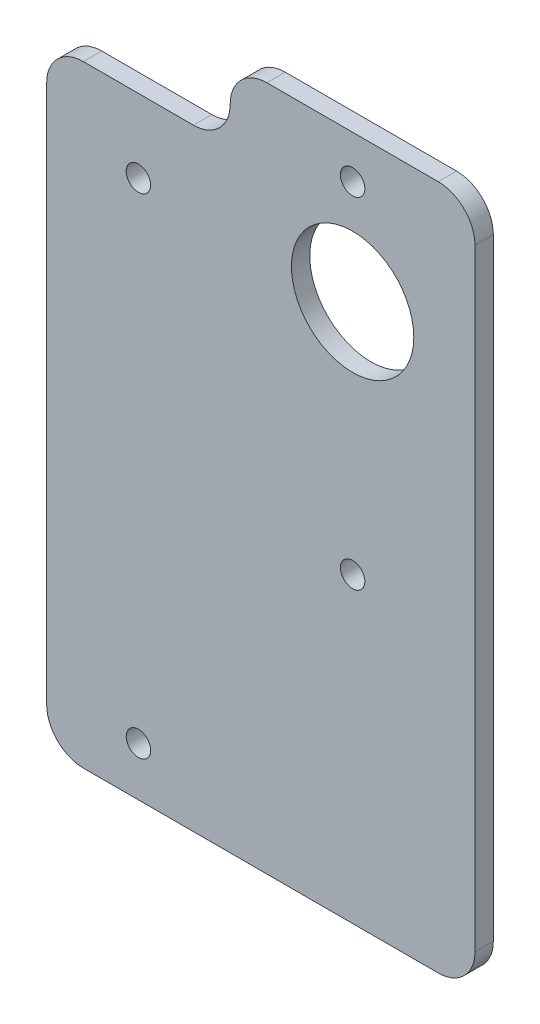
ISO-10303-21;
HEADER;
FILE_DESCRIPTION(('STEP AP214'),'2;1');
FILE_NAME('part.step','',(''),(''),'','','');
FILE_SCHEMA(('AUTOMOTIVE_DESIGN { 1 0 10303 214 1 1 1 1 }'));
ENDSEC;
DATA;
#1=APPLICATION_CONTEXT('core data for automotive mechanical design processes');
#2=APPLICATION_PROTOCOL_DEFINITION('international standard','automotive_design',2000,#1);
#3=PRODUCT_CONTEXT('',#1,'mechanical');
#4=PRODUCT('Part','Part','',(#3));
#5=PRODUCT_RELATED_PRODUCT_CATEGORY('part','',(#4));
#6=PRODUCT_DEFINITION_FORMATION('','',#4);
#7=PRODUCT_DEFINITION_CONTEXT('part definition',#1,'design');
#8=PRODUCT_DEFINITION('design','',#6,#7);
#9=PRODUCT_DEFINITION_SHAPE('','',#8);
#10=(LENGTH_UNIT() NAMED_UNIT(*) SI_UNIT(.MILLI.,.METRE.));
#11=(NAMED_UNIT(*) PLANE_ANGLE_UNIT() SI_UNIT($,.RADIAN.));
#12=(NAMED_UNIT(*) SI_UNIT($,.STERADIAN.) SOLID_ANGLE_UNIT());
#13=UNCERTAINTY_MEASURE_WITH_UNIT(LENGTH_MEASURE(1.E-05),#10,'distance_accuracy_value','');
#14=(GEOMETRIC_REPRESENTATION_CONTEXT(3) GLOBAL_UNCERTAINTY_ASSIGNED_CONTEXT((#13)) GLOBAL_UNIT_ASSIGNED_CONTEXT((#10,
#11,#12)) REPRESENTATION_CONTEXT('',''));
#15=CARTESIAN_POINT('',(0.,0.,0.));
#16=DIRECTION('',(0.,0.,1.));
#17=DIRECTION('',(1.,0.,0.));
#18=AXIS2_PLACEMENT_3D('',#15,#16,#17);
#19=CARTESIAN_POINT('',(0.,0.,1.5));
#20=DIRECTION('',(0.,0.,-1.));
#21=DIRECTION('',(-1.,0.,0.));
#22=AXIS2_PLACEMENT_3D('',#19,#20,#21);
#23=PLANE('',#22);
#24=CARTESIAN_POINT('',(17.4999999997106,-2.80000000006665,1.5));
#25=DIRECTION('',(0.,0.,1.));
#26=DIRECTION('',(1.,0.,0.));
#27=AXIS2_PLACEMENT_3D('',#24,#25,#26);
#28=CIRCLE('',#27,1.00000000018295);
#29=CARTESIAN_POINT('',(18.4999999998935,-2.80000000006665,1.5));
#30=VERTEX_POINT('',#29);
#31=EDGE_CURVE('E158',#30,#30,#28,.T.);
#32=ORIENTED_EDGE('',*,*,#31,.F.);
#33=EDGE_LOOP('',(#32));
#34=FACE_BOUND('',#33,.T.);
#35=CARTESIAN_POINT('',(17.4999999998581,24.9999999999334,1.5));
#36=DIRECTION('',(0.,0.,1.));
#37=DIRECTION('',(1.,0.,0.));
#38=AXIS2_PLACEMENT_3D('',#35,#36,#37);
#39=CIRCLE('',#38,1.00000000018295);
#40=CARTESIAN_POINT('',(18.500000000041,24.9999999999334,1.5));
#41=VERTEX_POINT('',#40);
#42=EDGE_CURVE('E237',#41,#41,#39,.T.);
#43=ORIENTED_EDGE('',*,*,#42,.F.);
#44=EDGE_LOOP('',(#43));
#45=FACE_BOUND('',#44,.T.);
#46=DIRECTION('',(-1.,0.,0.));
#47=VECTOR('',#46,1.);
#48=CARTESIAN_POINT('',(27.5,28.5,1.5));
#49=LINE('',#48,#47);
#50=CARTESIAN_POINT('',(24.5,28.5,1.5));
#51=VERTEX_POINT('',#50);
#52=CARTESIAN_POINT('',(10.5,28.5,1.5));
#53=VERTEX_POINT('',#52);
#54=EDGE_CURVE('E216',#51,#53,#49,.T.);
#55=ORIENTED_EDGE('',*,*,#54,.T.);
#56=CARTESIAN_POINT('',(10.5,25.5,1.5));
#57=DIRECTION('',(0.,0.,-1.));
#58=DIRECTION('',(-1.,0.,0.));
#59=AXIS2_PLACEMENT_3D('',#56,#57,#58);
#60=CIRCLE('',#59,3.);
#61=CARTESIAN_POINT('',(7.5,25.5,1.5));
#62=VERTEX_POINT('',#61);
#63=EDGE_CURVE('E48',#53,#62,#60,.F.);
#64=ORIENTED_EDGE('',*,*,#63,.T.);
#65=CARTESIAN_POINT('',(4.5,25.5,1.5));
#66=DIRECTION('',(0.,0.,-1.));
#67=DIRECTION('',(-1.,0.,0.));
#68=AXIS2_PLACEMENT_3D('',#65,#66,#67);
#69=CIRCLE('',#68,3.);
#70=CARTESIAN_POINT('',(4.5,22.5,1.5));
#71=VERTEX_POINT('',#70);
#72=EDGE_CURVE('E11',#62,#71,#69,.T.);
#73=ORIENTED_EDGE('',*,*,#72,.T.);
#74=DIRECTION('',(-1.,0.,0.));
#75=VECTOR('',#74,1.);
#76=CARTESIAN_POINT('',(7.5,22.5,1.5));
#77=LINE('',#76,#75);
#78=CARTESIAN_POINT('',(-4.5,22.5,1.5));
#79=VERTEX_POINT('',#78);
#80=EDGE_CURVE('E135',#71,#79,#77,.T.);
#81=ORIENTED_EDGE('',*,*,#80,.T.);
#82=CARTESIAN_POINT('',(-4.5,19.5,1.5));
#83=DIRECTION('',(0.,0.,-1.));
#84=DIRECTION('',(-1.,0.,0.));
#85=AXIS2_PLACEMENT_3D('',#82,#83,#84);
#86=CIRCLE('',#85,3.);
#87=CARTESIAN_POINT('',(-7.5,19.5,1.5));
#88=VERTEX_POINT('',#87);
#89=EDGE_CURVE('E182',#79,#88,#86,.F.);
#90=ORIENTED_EDGE('',*,*,#89,.T.);
#91=DIRECTION('',(0.,-1.,0.));
#92=VECTOR('',#91,1.);
#93=CARTESIAN_POINT('',(-7.5,22.5,1.5));
#94=LINE('',#93,#92);
#95=CARTESIAN_POINT('',(-7.49999999999999,-24.5,1.5));
#96=VERTEX_POINT('',#95);
#97=EDGE_CURVE('E143',#88,#96,#94,.T.);
#98=ORIENTED_EDGE('',*,*,#97,.T.);
#99=CARTESIAN_POINT('',(-4.49999999999999,-24.5,1.5));
#100=DIRECTION('',(0.,0.,-1.));
#101=DIRECTION('',(-1.,0.,0.));
#102=AXIS2_PLACEMENT_3D('',#99,#100,#101);
#103=CIRCLE('',#102,3.);
#104=CARTESIAN_POINT('',(-4.49999999999999,-27.5,1.5));
#105=VERTEX_POINT('',#104);
#106=EDGE_CURVE('E178',#96,#105,#103,.F.);
#107=ORIENTED_EDGE('',*,*,#106,.T.);
#108=DIRECTION('',(1.,0.,0.));
#109=VECTOR('',#108,1.);
#110=CARTESIAN_POINT('',(7.49999999999999,-27.5,1.5));
#111=LINE('',#110,#109);
#112=CARTESIAN_POINT('',(24.5,-27.5,1.5));
#113=VERTEX_POINT('',#112);
#114=EDGE_CURVE('E147',#105,#113,#111,.T.);
#115=ORIENTED_EDGE('',*,*,#114,.T.);
#116=CARTESIAN_POINT('',(24.5,-24.5,1.5));
#117=DIRECTION('',(0.,0.,-1.));
#118=DIRECTION('',(-1.,0.,0.));
#119=AXIS2_PLACEMENT_3D('',#116,#117,#118);
#120=CIRCLE('',#119,3.);
#121=CARTESIAN_POINT('',(27.5,-24.5,1.5));
#122=VERTEX_POINT('',#121);
#123=EDGE_CURVE('E176',#113,#122,#120,.F.);
#124=ORIENTED_EDGE('',*,*,#123,.T.);
#125=DIRECTION('',(0.,1.,0.));
#126=VECTOR('',#125,1.);
#127=CARTESIAN_POINT('',(27.5,-27.5,1.5));
#128=LINE('',#127,#126);
#129=CARTESIAN_POINT('',(27.5,25.5,1.5));
#130=VERTEX_POINT('',#129);
#131=EDGE_CURVE('E218',#122,#130,#128,.T.);
#132=ORIENTED_EDGE('',*,*,#131,.T.);
#133=CARTESIAN_POINT('',(24.5,25.5,1.5));
#134=DIRECTION('',(0.,0.,-1.));
#135=DIRECTION('',(-1.,0.,0.));
#136=AXIS2_PLACEMENT_3D('',#133,#134,#135);
#137=CIRCLE('',#136,3.);
#138=EDGE_CURVE('E180',#130,#51,#137,.F.);
#139=ORIENTED_EDGE('',*,*,#138,.T.);
#140=EDGE_LOOP('',(#55,#64,#73,#81,#90,#98,#107,#115,#124,#132,#139));
#141=FACE_BOUND('',#140,.T.);
#142=CARTESIAN_POINT('',(0.,-23.5,1.5));
#143=DIRECTION('',(0.,0.,1.));
#144=DIRECTION('',(1.,0.,0.));
#145=AXIS2_PLACEMENT_3D('',#142,#143,#144);
#146=CIRCLE('',#145,1.);
#147=CARTESIAN_POINT('',(1.,-23.5,1.5));
#148=VERTEX_POINT('',#147);
#149=EDGE_CURVE('E212',#148,#148,#146,.T.);
#150=ORIENTED_EDGE('',*,*,#149,.F.);
#151=EDGE_LOOP('',(#150));
#152=FACE_BOUND('',#151,.T.);
#153=CARTESIAN_POINT('',(0.,16.5,1.5));
#154=DIRECTION('',(0.,0.,1.));
#155=DIRECTION('',(1.,0.,0.));
#156=AXIS2_PLACEMENT_3D('',#153,#154,#155);
#157=CIRCLE('',#156,1.);
#158=CARTESIAN_POINT('',(1.,16.5,1.5));
#159=VERTEX_POINT('',#158);
#160=EDGE_CURVE('E224',#159,#159,#157,.T.);
#161=ORIENTED_EDGE('',*,*,#160,.F.);
#162=EDGE_LOOP('',(#161));
#163=FACE_BOUND('',#162,.T.);
#164=CARTESIAN_POINT('',(17.5,16.5,1.5));
#165=DIRECTION('',(0.,0.,1.));
#166=DIRECTION('',(1.,0.,0.));
#167=AXIS2_PLACEMENT_3D('',#164,#165,#166);
#168=CIRCLE('',#167,5.);
#169=CARTESIAN_POINT('',(22.5,16.5,1.5));
#170=VERTEX_POINT('',#169);
#171=EDGE_CURVE('E230',#170,#170,#168,.T.);
#172=ORIENTED_EDGE('',*,*,#171,.F.);
#173=EDGE_LOOP('',(#172));
#174=FACE_BOUND('',#173,.T.);
#175=ADVANCED_FACE('F33',(#34,#45,#141,#152,#163,#174),#23,.F.);
#176=CARTESIAN_POINT('',(0.,0.,0.));
#177=DIRECTION('',(0.,0.,-1.));
#178=DIRECTION('',(-1.,0.,0.));
#179=AXIS2_PLACEMENT_3D('',#176,#177,#178);
#180=PLANE('',#179);
#181=CARTESIAN_POINT('',(17.4999999997106,-2.80000000006665,0.));
#182=DIRECTION('',(0.,0.,-1.));
#183=DIRECTION('',(-1.,0.,0.));
#184=AXIS2_PLACEMENT_3D('',#181,#182,#183);
#185=CIRCLE('',#184,1.00000000018295);
#186=CARTESIAN_POINT('',(16.4999999995276,-2.80000000006665,0.));
#187=VERTEX_POINT('',#186);
#188=EDGE_CURVE('E157',#187,#187,#185,.T.);
#189=ORIENTED_EDGE('',*,*,#188,.F.);
#190=EDGE_LOOP('',(#189));
#191=FACE_BOUND('',#190,.T.);
#192=CARTESIAN_POINT('',(17.4999999998581,24.9999999999334,0.));
#193=DIRECTION('',(0.,0.,-1.));
#194=DIRECTION('',(-1.,0.,0.));
#195=AXIS2_PLACEMENT_3D('',#192,#193,#194);
#196=CIRCLE('',#195,1.00000000018295);
#197=CARTESIAN_POINT('',(16.4999999996751,24.9999999999334,0.));
#198=VERTEX_POINT('',#197);
#199=EDGE_CURVE('E154',#198,#198,#196,.T.);
#200=ORIENTED_EDGE('',*,*,#199,.F.);
#201=EDGE_LOOP('',(#200));
#202=FACE_BOUND('',#201,.T.);
#203=CARTESIAN_POINT('',(0.,16.5,0.));
#204=DIRECTION('',(0.,0.,1.));
#205=DIRECTION('',(1.,0.,0.));
#206=AXIS2_PLACEMENT_3D('',#203,#204,#205);
#207=CIRCLE('',#206,1.);
#208=CARTESIAN_POINT('',(1.,16.5,0.));
#209=VERTEX_POINT('',#208);
#210=EDGE_CURVE('E227',#209,#209,#207,.T.);
#211=ORIENTED_EDGE('',*,*,#210,.T.);
#212=EDGE_LOOP('',(#211));
#213=FACE_BOUND('',#212,.T.);
#214=DIRECTION('',(-1.,0.,0.));
#215=VECTOR('',#214,1.);
#216=CARTESIAN_POINT('',(7.5,22.5,0.));
#217=LINE('',#216,#215);
#218=CARTESIAN_POINT('',(4.5,22.5,0.));
#219=VERTEX_POINT('',#218);
#220=CARTESIAN_POINT('',(-4.5,22.5,0.));
#221=VERTEX_POINT('',#220);
#222=EDGE_CURVE('E132',#219,#221,#217,.T.);
#223=ORIENTED_EDGE('',*,*,#222,.F.);
#224=CARTESIAN_POINT('',(4.5,25.5,0.));
#225=DIRECTION('',(0.,0.,-1.));
#226=DIRECTION('',(-1.,0.,0.));
#227=AXIS2_PLACEMENT_3D('',#224,#225,#226);
#228=CIRCLE('',#227,3.);
#229=CARTESIAN_POINT('',(7.5,25.5,0.));
#230=VERTEX_POINT('',#229);
#231=EDGE_CURVE('E42',#219,#230,#228,.F.);
#232=ORIENTED_EDGE('',*,*,#231,.T.);
#233=CARTESIAN_POINT('',(10.5,25.5,0.));
#234=DIRECTION('',(0.,0.,-1.));
#235=DIRECTION('',(-1.,0.,0.));
#236=AXIS2_PLACEMENT_3D('',#233,#234,#235);
#237=CIRCLE('',#236,3.);
#238=CARTESIAN_POINT('',(10.5,28.5,0.));
#239=VERTEX_POINT('',#238);
#240=EDGE_CURVE('E169',#230,#239,#237,.T.);
#241=ORIENTED_EDGE('',*,*,#240,.T.);
#242=DIRECTION('',(-1.,0.,0.));
#243=VECTOR('',#242,1.);
#244=CARTESIAN_POINT('',(27.5,28.5,0.));
#245=LINE('',#244,#243);
#246=CARTESIAN_POINT('',(24.5,28.5,0.));
#247=VERTEX_POINT('',#246);
#248=EDGE_CURVE('E144',#247,#239,#245,.T.);
#249=ORIENTED_EDGE('',*,*,#248,.F.);
#250=CARTESIAN_POINT('',(24.5,25.5,0.));
#251=DIRECTION('',(0.,0.,-1.));
#252=DIRECTION('',(-1.,0.,0.));
#253=AXIS2_PLACEMENT_3D('',#250,#251,#252);
#254=CIRCLE('',#253,3.);
#255=CARTESIAN_POINT('',(27.5,25.5,0.));
#256=VERTEX_POINT('',#255);
#257=EDGE_CURVE('E166',#247,#256,#254,.T.);
#258=ORIENTED_EDGE('',*,*,#257,.T.);
#259=DIRECTION('',(0.,1.,0.));
#260=VECTOR('',#259,1.);
#261=CARTESIAN_POINT('',(27.5,22.5,0.));
#262=LINE('',#261,#260);
#263=CARTESIAN_POINT('',(27.5,-24.5,0.));
#264=VERTEX_POINT('',#263);
#265=EDGE_CURVE('E150',#264,#256,#262,.T.);
#266=ORIENTED_EDGE('',*,*,#265,.F.);
#267=CARTESIAN_POINT('',(24.5,-24.5,0.));
#268=DIRECTION('',(0.,0.,-1.));
#269=DIRECTION('',(-1.,0.,0.));
#270=AXIS2_PLACEMENT_3D('',#267,#268,#269);
#271=CIRCLE('',#270,3.);
#272=CARTESIAN_POINT('',(24.5,-27.5,0.));
#273=VERTEX_POINT('',#272);
#274=EDGE_CURVE('E136',#264,#273,#271,.T.);
#275=ORIENTED_EDGE('',*,*,#274,.T.);
#276=DIRECTION('',(1.,0.,0.));
#277=VECTOR('',#276,1.);
#278=CARTESIAN_POINT('',(7.49999999999999,-27.5,0.));
#279=LINE('',#278,#277);
#280=CARTESIAN_POINT('',(-4.49999999999999,-27.5,0.));
#281=VERTEX_POINT('',#280);
#282=EDGE_CURVE('E203',#281,#273,#279,.T.);
#283=ORIENTED_EDGE('',*,*,#282,.F.);
#284=CARTESIAN_POINT('',(-4.49999999999999,-24.5,0.));
#285=DIRECTION('',(0.,0.,-1.));
#286=DIRECTION('',(-1.,0.,0.));
#287=AXIS2_PLACEMENT_3D('',#284,#285,#286);
#288=CIRCLE('',#287,3.);
#289=CARTESIAN_POINT('',(-7.49999999999999,-24.5,0.));
#290=VERTEX_POINT('',#289);
#291=EDGE_CURVE('E164',#281,#290,#288,.T.);
#292=ORIENTED_EDGE('',*,*,#291,.T.);
#293=DIRECTION('',(0.,-1.,0.));
#294=VECTOR('',#293,1.);
#295=CARTESIAN_POINT('',(-7.5,22.5,0.));
#296=LINE('',#295,#294);
#297=CARTESIAN_POINT('',(-7.5,19.5,0.));
#298=VERTEX_POINT('',#297);
#299=EDGE_CURVE('E210',#298,#290,#296,.T.);
#300=ORIENTED_EDGE('',*,*,#299,.F.);
#301=CARTESIAN_POINT('',(-4.5,19.5,0.));
#302=DIRECTION('',(0.,0.,-1.));
#303=DIRECTION('',(-1.,0.,0.));
#304=AXIS2_PLACEMENT_3D('',#301,#302,#303);
#305=CIRCLE('',#304,3.);
#306=EDGE_CURVE('E142',#298,#221,#305,.T.);
#307=ORIENTED_EDGE('',*,*,#306,.T.);
#308=EDGE_LOOP('',(#223,#232,#241,#249,#258,#266,#275,#283,#292,#300,#307));
#309=FACE_BOUND('',#308,.T.);
#310=CARTESIAN_POINT('',(0.,-23.5,0.));
#311=DIRECTION('',(0.,0.,1.));
#312=DIRECTION('',(1.,0.,0.));
#313=AXIS2_PLACEMENT_3D('',#310,#311,#312);
#314=CIRCLE('',#313,1.);
#315=CARTESIAN_POINT('',(1.,-23.5,0.));
#316=VERTEX_POINT('',#315);
#317=EDGE_CURVE('E221',#316,#316,#314,.T.);
#318=ORIENTED_EDGE('',*,*,#317,.T.);
#319=EDGE_LOOP('',(#318));
#320=FACE_BOUND('',#319,.T.);
#321=CARTESIAN_POINT('',(17.5,16.5,0.));
#322=DIRECTION('',(0.,0.,1.));
#323=DIRECTION('',(1.,0.,0.));
#324=AXIS2_PLACEMENT_3D('',#321,#322,#323);
#325=CIRCLE('',#324,5.);
#326=CARTESIAN_POINT('',(22.5,16.5,0.));
#327=VERTEX_POINT('',#326);
#328=EDGE_CURVE('E161',#327,#327,#325,.T.);
#329=ORIENTED_EDGE('',*,*,#328,.T.);
#330=EDGE_LOOP('',(#329));
#331=FACE_BOUND('',#330,.T.);
#332=ADVANCED_FACE('F139',(#191,#202,#213,#309,#320,#331),#180,.T.);
#333=CARTESIAN_POINT('',(-7.5,22.5,1.5));
#334=DIRECTION('',(1.,0.,0.));
#335=DIRECTION('',(0.,1.,0.));
#336=AXIS2_PLACEMENT_3D('',#333,#334,#335);
#337=PLANE('',#336);
#338=ORIENTED_EDGE('',*,*,#97,.F.);
#339=DIRECTION('',(0.,0.,-1.));
#340=VECTOR('',#339,1.);
#341=CARTESIAN_POINT('',(-7.5,19.5,1.5));
#342=LINE('',#341,#340);
#343=EDGE_CURVE('E187',#88,#298,#342,.T.);
#344=ORIENTED_EDGE('',*,*,#343,.T.);
#345=ORIENTED_EDGE('',*,*,#299,.T.);
#346=DIRECTION('',(0.,0.,-1.));
#347=VECTOR('',#346,1.);
#348=CARTESIAN_POINT('',(-7.49999999999999,-24.5,1.5));
#349=LINE('',#348,#347);
#350=EDGE_CURVE('E185',#290,#96,#349,.F.);
#351=ORIENTED_EDGE('',*,*,#350,.T.);
#352=EDGE_LOOP('',(#338,#344,#345,#351));
#353=FACE_BOUND('',#352,.T.);
#354=ADVANCED_FACE('F266',(#353),#337,.F.);
#355=CARTESIAN_POINT('',(7.49999999999999,-27.5,1.5));
#356=DIRECTION('',(0.,1.,0.));
#357=DIRECTION('',(0.,0.,1.));
#358=AXIS2_PLACEMENT_3D('',#355,#356,#357);
#359=PLANE('',#358);
#360=ORIENTED_EDGE('',*,*,#114,.F.);
#361=DIRECTION('',(0.,0.,-1.));
#362=VECTOR('',#361,1.);
#363=CARTESIAN_POINT('',(-4.49999999999999,-27.5,1.5));
#364=LINE('',#363,#362);
#365=EDGE_CURVE('E126',#105,#281,#364,.T.);
#366=ORIENTED_EDGE('',*,*,#365,.T.);
#367=ORIENTED_EDGE('',*,*,#282,.T.);
#368=DIRECTION('',(0.,0.,-1.));
#369=VECTOR('',#368,1.);
#370=CARTESIAN_POINT('',(24.5,-27.5,1.5));
#371=LINE('',#370,#369);
#372=EDGE_CURVE('E194',#273,#113,#371,.F.);
#373=ORIENTED_EDGE('',*,*,#372,.T.);
#374=EDGE_LOOP('',(#360,#366,#367,#373));
#375=FACE_BOUND('',#374,.T.);
#376=ADVANCED_FACE('F202',(#375),#359,.F.);
#377=CARTESIAN_POINT('',(27.5,22.5,1.5));
#378=DIRECTION('',(-1.,0.,0.));
#379=DIRECTION('',(0.,0.,1.));
#380=AXIS2_PLACEMENT_3D('',#377,#378,#379);
#381=PLANE('',#380);
#382=ORIENTED_EDGE('',*,*,#265,.T.);
#383=DIRECTION('',(0.,0.,-1.));
#384=VECTOR('',#383,1.);
#385=CARTESIAN_POINT('',(27.5,25.5,1.5));
#386=LINE('',#385,#384);
#387=EDGE_CURVE('E56',#256,#130,#386,.F.);
#388=ORIENTED_EDGE('',*,*,#387,.T.);
#389=ORIENTED_EDGE('',*,*,#131,.F.);
#390=DIRECTION('',(0.,0.,-1.));
#391=VECTOR('',#390,1.);
#392=CARTESIAN_POINT('',(27.5,-24.5,1.5));
#393=LINE('',#392,#391);
#394=EDGE_CURVE('E190',#122,#264,#393,.T.);
#395=ORIENTED_EDGE('',*,*,#394,.T.);
#396=EDGE_LOOP('',(#382,#388,#389,#395));
#397=FACE_BOUND('',#396,.T.);
#398=ADVANCED_FACE('F284',(#397),#381,.F.);
#399=CARTESIAN_POINT('',(27.5,28.5,1.5));
#400=DIRECTION('',(0.,-1.,0.));
#401=DIRECTION('',(1.,0.,0.));
#402=AXIS2_PLACEMENT_3D('',#399,#400,#401);
#403=PLANE('',#402);
#404=ORIENTED_EDGE('',*,*,#248,.T.);
#405=DIRECTION('',(0.,0.,-1.));
#406=VECTOR('',#405,1.);
#407=CARTESIAN_POINT('',(10.5,28.5,1.5));
#408=LINE('',#407,#406);
#409=EDGE_CURVE('E174',#239,#53,#408,.F.);
#410=ORIENTED_EDGE('',*,*,#409,.T.);
#411=ORIENTED_EDGE('',*,*,#54,.F.);
#412=DIRECTION('',(0.,0.,-1.));
#413=VECTOR('',#412,1.);
#414=CARTESIAN_POINT('',(24.5,28.5,1.5));
#415=LINE('',#414,#413);
#416=EDGE_CURVE('E171',#51,#247,#415,.T.);
#417=ORIENTED_EDGE('',*,*,#416,.T.);
#418=EDGE_LOOP('',(#404,#410,#411,#417));
#419=FACE_BOUND('',#418,.T.);
#420=ADVANCED_FACE('F281',(#419),#403,.F.);
#421=CARTESIAN_POINT('',(7.5,22.5,1.5));
#422=DIRECTION('',(0.,-1.,0.));
#423=DIRECTION('',(0.,0.,-1.));
#424=AXIS2_PLACEMENT_3D('',#421,#422,#423);
#425=PLANE('',#424);
#426=ORIENTED_EDGE('',*,*,#80,.F.);
#427=DIRECTION('',(0.,0.,-1.));
#428=VECTOR('',#427,1.);
#429=CARTESIAN_POINT('',(4.5,22.5,0.));
#430=LINE('',#429,#428);
#431=EDGE_CURVE('E122',#71,#219,#430,.T.);
#432=ORIENTED_EDGE('',*,*,#431,.T.);
#433=ORIENTED_EDGE('',*,*,#222,.T.);
#434=DIRECTION('',(0.,0.,-1.));
#435=VECTOR('',#434,1.);
#436=CARTESIAN_POINT('',(-4.5,22.5,1.5));
#437=LINE('',#436,#435);
#438=EDGE_CURVE('E137',#221,#79,#437,.F.);
#439=ORIENTED_EDGE('',*,*,#438,.T.);
#440=EDGE_LOOP('',(#426,#432,#433,#439));
#441=FACE_BOUND('',#440,.T.);
#442=ADVANCED_FACE('F131',(#441),#425,.F.);
#443=CARTESIAN_POINT('',(0.,-23.5,1.5));
#444=DIRECTION('',(0.,0.,-1.));
#445=DIRECTION('',(-1.,0.,0.));
#446=AXIS2_PLACEMENT_3D('',#443,#444,#445);
#447=CYLINDRICAL_SURFACE('',#446,1.);
#448=ORIENTED_EDGE('',*,*,#149,.T.);
#449=EDGE_LOOP('',(#448));
#450=FACE_BOUND('',#449,.T.);
#451=ORIENTED_EDGE('',*,*,#317,.F.);
#452=EDGE_LOOP('',(#451));
#453=FACE_BOUND('',#452,.T.);
#454=ADVANCED_FACE('F280',(#450,#453),#447,.F.);
#455=CARTESIAN_POINT('',(0.,16.5,1.5));
#456=DIRECTION('',(0.,0.,-1.));
#457=DIRECTION('',(-1.,0.,0.));
#458=AXIS2_PLACEMENT_3D('',#455,#456,#457);
#459=CYLINDRICAL_SURFACE('',#458,1.);
#460=ORIENTED_EDGE('',*,*,#160,.T.);
#461=EDGE_LOOP('',(#460));
#462=FACE_BOUND('',#461,.T.);
#463=ORIENTED_EDGE('',*,*,#210,.F.);
#464=EDGE_LOOP('',(#463));
#465=FACE_BOUND('',#464,.T.);
#466=ADVANCED_FACE('F261',(#462,#465),#459,.F.);
#467=CARTESIAN_POINT('',(17.5,16.5,1.5));
#468=DIRECTION('',(0.,0.,-1.));
#469=DIRECTION('',(-1.,0.,0.));
#470=AXIS2_PLACEMENT_3D('',#467,#468,#469);
#471=CYLINDRICAL_SURFACE('',#470,5.);
#472=ORIENTED_EDGE('',*,*,#171,.T.);
#473=EDGE_LOOP('',(#472));
#474=FACE_BOUND('',#473,.T.);
#475=ORIENTED_EDGE('',*,*,#328,.F.);
#476=EDGE_LOOP('',(#475));
#477=FACE_BOUND('',#476,.T.);
#478=ADVANCED_FACE('F257',(#474,#477),#471,.F.);
#479=CARTESIAN_POINT('',(17.4999999998581,24.9999999999334,-8.5));
#480=DIRECTION('',(0.,0.,1.));
#481=DIRECTION('',(1.,0.,0.));
#482=AXIS2_PLACEMENT_3D('',#479,#480,#481);
#483=CYLINDRICAL_SURFACE('',#482,1.00000000018295);
#484=ORIENTED_EDGE('',*,*,#199,.T.);
#485=EDGE_LOOP('',(#484));
#486=FACE_BOUND('',#485,.T.);
#487=ORIENTED_EDGE('',*,*,#42,.T.);
#488=EDGE_LOOP('',(#487));
#489=FACE_BOUND('',#488,.T.);
#490=ADVANCED_FACE('F260',(#486,#489),#483,.F.);
#491=CARTESIAN_POINT('',(17.4999999997106,-2.80000000006665,-8.5));
#492=DIRECTION('',(0.,0.,1.));
#493=DIRECTION('',(1.,0.,0.));
#494=AXIS2_PLACEMENT_3D('',#491,#492,#493);
#495=CYLINDRICAL_SURFACE('',#494,1.00000000018295);
#496=ORIENTED_EDGE('',*,*,#188,.T.);
#497=EDGE_LOOP('',(#496));
#498=FACE_BOUND('',#497,.T.);
#499=ORIENTED_EDGE('',*,*,#31,.T.);
#500=EDGE_LOOP('',(#499));
#501=FACE_BOUND('',#500,.T.);
#502=ADVANCED_FACE('F243',(#498,#501),#495,.F.);
#503=CARTESIAN_POINT('',(10.5,25.5,1.5));
#504=DIRECTION('',(0.,0.,-1.));
#505=DIRECTION('',(-1.,0.,0.));
#506=AXIS2_PLACEMENT_3D('',#503,#504,#505);
#507=CYLINDRICAL_SURFACE('',#506,3.);
#508=DIRECTION('',(0.,0.,-1.));
#509=VECTOR('',#508,1.);
#510=CARTESIAN_POINT('',(7.5,25.5,1.5));
#511=LINE('',#510,#509);
#512=EDGE_CURVE('E37',#62,#230,#511,.T.);
#513=ORIENTED_EDGE('',*,*,#512,.F.);
#514=ORIENTED_EDGE('',*,*,#63,.F.);
#515=ORIENTED_EDGE('',*,*,#409,.F.);
#516=ORIENTED_EDGE('',*,*,#240,.F.);
#517=EDGE_LOOP('',(#513,#514,#515,#516));
#518=FACE_BOUND('',#517,.T.);
#519=ADVANCED_FACE('F293',(#518),#507,.T.);
#520=CARTESIAN_POINT('',(4.5,25.5,1.5));
#521=DIRECTION('',(0.,0.,1.));
#522=DIRECTION('',(1.,0.,0.));
#523=AXIS2_PLACEMENT_3D('',#520,#521,#522);
#524=CYLINDRICAL_SURFACE('',#523,3.);
#525=ORIENTED_EDGE('',*,*,#72,.F.);
#526=ORIENTED_EDGE('',*,*,#512,.T.);
#527=ORIENTED_EDGE('',*,*,#231,.F.);
#528=ORIENTED_EDGE('',*,*,#431,.F.);
#529=EDGE_LOOP('',(#525,#526,#527,#528));
#530=FACE_BOUND('',#529,.T.);
#531=ADVANCED_FACE('F121',(#530),#524,.F.);
#532=CARTESIAN_POINT('',(-4.5,19.5,1.5));
#533=DIRECTION('',(0.,0.,-1.));
#534=DIRECTION('',(-1.,0.,0.));
#535=AXIS2_PLACEMENT_3D('',#532,#533,#534);
#536=CYLINDRICAL_SURFACE('',#535,3.);
#537=ORIENTED_EDGE('',*,*,#89,.F.);
#538=ORIENTED_EDGE('',*,*,#438,.F.);
#539=ORIENTED_EDGE('',*,*,#306,.F.);
#540=ORIENTED_EDGE('',*,*,#343,.F.);
#541=EDGE_LOOP('',(#537,#538,#539,#540));
#542=FACE_BOUND('',#541,.T.);
#543=ADVANCED_FACE('F292',(#542),#536,.T.);
#544=CARTESIAN_POINT('',(24.5,25.5,1.5));
#545=DIRECTION('',(0.,0.,-1.));
#546=DIRECTION('',(-1.,0.,0.));
#547=AXIS2_PLACEMENT_3D('',#544,#545,#546);
#548=CYLINDRICAL_SURFACE('',#547,3.);
#549=ORIENTED_EDGE('',*,*,#138,.F.);
#550=ORIENTED_EDGE('',*,*,#387,.F.);
#551=ORIENTED_EDGE('',*,*,#257,.F.);
#552=ORIENTED_EDGE('',*,*,#416,.F.);
#553=EDGE_LOOP('',(#549,#550,#551,#552));
#554=FACE_BOUND('',#553,.T.);
#555=ADVANCED_FACE('F299',(#554),#548,.T.);
#556=CARTESIAN_POINT('',(-4.49999999999999,-24.5,1.5));
#557=DIRECTION('',(0.,0.,-1.));
#558=DIRECTION('',(-1.,0.,0.));
#559=AXIS2_PLACEMENT_3D('',#556,#557,#558);
#560=CYLINDRICAL_SURFACE('',#559,3.);
#561=ORIENTED_EDGE('',*,*,#106,.F.);
#562=ORIENTED_EDGE('',*,*,#350,.F.);
#563=ORIENTED_EDGE('',*,*,#291,.F.);
#564=ORIENTED_EDGE('',*,*,#365,.F.);
#565=EDGE_LOOP('',(#561,#562,#563,#564));
#566=FACE_BOUND('',#565,.T.);
#567=ADVANCED_FACE('F302',(#566),#560,.T.);
#568=CARTESIAN_POINT('',(24.5,-24.5,1.5));
#569=DIRECTION('',(0.,0.,-1.));
#570=DIRECTION('',(-1.,0.,0.));
#571=AXIS2_PLACEMENT_3D('',#568,#569,#570);
#572=CYLINDRICAL_SURFACE('',#571,3.);
#573=ORIENTED_EDGE('',*,*,#123,.F.);
#574=ORIENTED_EDGE('',*,*,#372,.F.);
#575=ORIENTED_EDGE('',*,*,#274,.F.);
#576=ORIENTED_EDGE('',*,*,#394,.F.);
#577=EDGE_LOOP('',(#573,#574,#575,#576));
#578=FACE_BOUND('',#577,.T.);
#579=ADVANCED_FACE('F35',(#578),#572,.T.);
#580=CLOSED_SHELL('',(#175,#332,#354,#376,#398,#420,#442,#454,#466,#478,#490,#502,#519,#531,
#543,#555,#567,#579));
#581=MANIFOLD_SOLID_BREP('B2',#580);
#582=ADVANCED_BREP_SHAPE_REPRESENTATION('',(#18,#581),#14);
#583=SHAPE_DEFINITION_REPRESENTATION(#9,#582);
ENDSEC;
END-ISO-10303-21;
